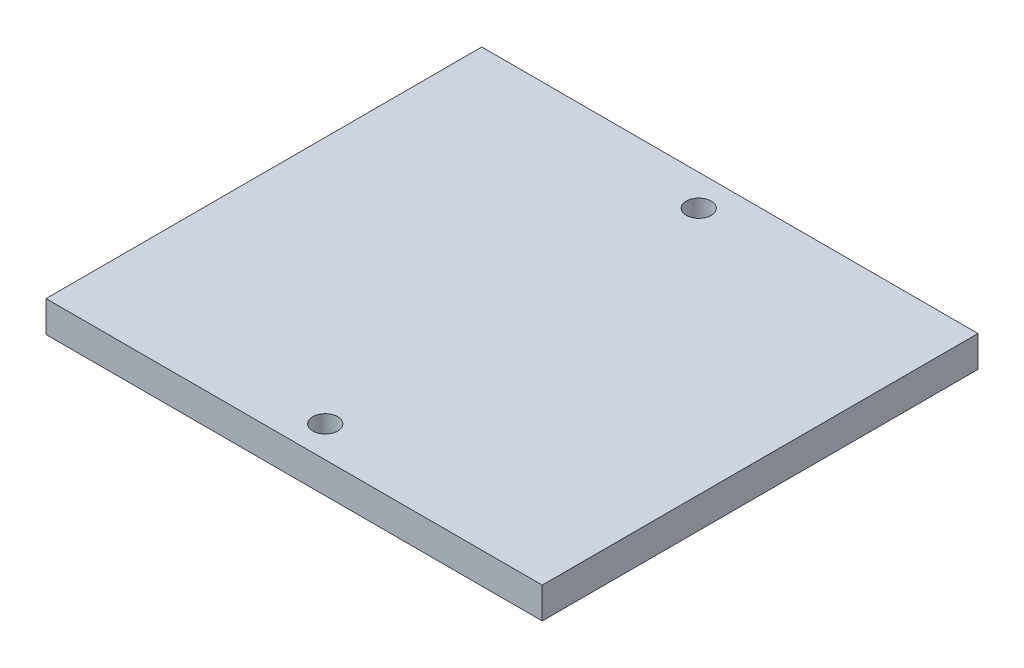
ISO-10303-21;
HEADER;
FILE_DESCRIPTION(('STEP AP214'),'2;1');
FILE_NAME('part.step','',(''),(''),'','','');
FILE_SCHEMA(('AUTOMOTIVE_DESIGN { 1 0 10303 214 1 1 1 1 }'));
ENDSEC;
DATA;
#1=APPLICATION_CONTEXT('core data for automotive mechanical design processes');
#2=APPLICATION_PROTOCOL_DEFINITION('international standard','automotive_design',2000,#1);
#3=PRODUCT_CONTEXT('',#1,'mechanical');
#4=PRODUCT('Part','Part','',(#3));
#5=PRODUCT_RELATED_PRODUCT_CATEGORY('part','',(#4));
#6=PRODUCT_DEFINITION_FORMATION('','',#4);
#7=PRODUCT_DEFINITION_CONTEXT('part definition',#1,'design');
#8=PRODUCT_DEFINITION('design','',#6,#7);
#9=PRODUCT_DEFINITION_SHAPE('','',#8);
#10=(LENGTH_UNIT() NAMED_UNIT(*) SI_UNIT(.MILLI.,.METRE.));
#11=(NAMED_UNIT(*) PLANE_ANGLE_UNIT() SI_UNIT($,.RADIAN.));
#12=(NAMED_UNIT(*) SI_UNIT($,.STERADIAN.) SOLID_ANGLE_UNIT());
#13=UNCERTAINTY_MEASURE_WITH_UNIT(LENGTH_MEASURE(1.E-05),#10,'distance_accuracy_value','');
#14=(GEOMETRIC_REPRESENTATION_CONTEXT(3) GLOBAL_UNCERTAINTY_ASSIGNED_CONTEXT((#13)) GLOBAL_UNIT_ASSIGNED_CONTEXT((#10,
#11,#12)) REPRESENTATION_CONTEXT('',''));
#15=CARTESIAN_POINT('',(0.,0.,0.));
#16=DIRECTION('',(0.,0.,1.));
#17=DIRECTION('',(1.,0.,0.));
#18=AXIS2_PLACEMENT_3D('',#15,#16,#17);
#19=CARTESIAN_POINT('',(50.61875,6.35,44.45));
#20=DIRECTION('',(-1.,0.,0.));
#21=DIRECTION('',(0.,0.,1.));
#22=AXIS2_PLACEMENT_3D('',#19,#20,#21);
#23=PLANE('',#22);
#24=DIRECTION('',(0.,0.,-1.));
#25=VECTOR('',#24,1.);
#26=CARTESIAN_POINT('',(50.61875,0.,44.45));
#27=LINE('',#26,#25);
#28=CARTESIAN_POINT('',(50.61875,0.,44.45));
#29=VERTEX_POINT('',#28);
#30=CARTESIAN_POINT('',(50.61875,0.,-44.45));
#31=VERTEX_POINT('',#30);
#32=EDGE_CURVE('E111',#29,#31,#27,.T.);
#33=ORIENTED_EDGE('',*,*,#32,.T.);
#34=DIRECTION('',(0.,-1.,0.));
#35=VECTOR('',#34,1.);
#36=CARTESIAN_POINT('',(50.61875,6.35,-44.45));
#37=LINE('',#36,#35);
#38=CARTESIAN_POINT('',(50.61875,6.35,-44.45));
#39=VERTEX_POINT('',#38);
#40=EDGE_CURVE('E11',#39,#31,#37,.T.);
#41=ORIENTED_EDGE('',*,*,#40,.F.);
#42=DIRECTION('',(0.,0.,-1.));
#43=VECTOR('',#42,1.);
#44=CARTESIAN_POINT('',(50.61875,6.35,44.45));
#45=LINE('',#44,#43);
#46=CARTESIAN_POINT('',(50.61875,6.35,44.45));
#47=VERTEX_POINT('',#46);
#48=EDGE_CURVE('E95',#47,#39,#45,.T.);
#49=ORIENTED_EDGE('',*,*,#48,.F.);
#50=DIRECTION('',(0.,-1.,0.));
#51=VECTOR('',#50,1.);
#52=CARTESIAN_POINT('',(50.61875,6.35,44.45));
#53=LINE('',#52,#51);
#54=EDGE_CURVE('E107',#47,#29,#53,.T.);
#55=ORIENTED_EDGE('',*,*,#54,.T.);
#56=EDGE_LOOP('',(#33,#41,#49,#55));
#57=FACE_BOUND('',#56,.T.);
#58=ADVANCED_FACE('F43',(#57),#23,.F.);
#59=CARTESIAN_POINT('',(-50.61875,6.35,-44.45));
#60=DIRECTION('',(0.,0.,1.));
#61=DIRECTION('',(1.,0.,0.));
#62=AXIS2_PLACEMENT_3D('',#59,#60,#61);
#63=PLANE('',#62);
#64=DIRECTION('',(-1.,0.,0.));
#65=VECTOR('',#64,1.);
#66=CARTESIAN_POINT('',(-50.61875,0.,-44.45));
#67=LINE('',#66,#65);
#68=CARTESIAN_POINT('',(-50.61875,0.,-44.45));
#69=VERTEX_POINT('',#68);
#70=EDGE_CURVE('E100',#31,#69,#67,.T.);
#71=ORIENTED_EDGE('',*,*,#70,.T.);
#72=DIRECTION('',(0.,-1.,0.));
#73=VECTOR('',#72,1.);
#74=CARTESIAN_POINT('',(-50.61875,6.35,-44.45));
#75=LINE('',#74,#73);
#76=CARTESIAN_POINT('',(-50.61875,6.35,-44.45));
#77=VERTEX_POINT('',#76);
#78=EDGE_CURVE('E52',#77,#69,#75,.T.);
#79=ORIENTED_EDGE('',*,*,#78,.F.);
#80=DIRECTION('',(-1.,0.,0.));
#81=VECTOR('',#80,1.);
#82=CARTESIAN_POINT('',(-50.61875,6.35,-44.45));
#83=LINE('',#82,#81);
#84=EDGE_CURVE('E90',#39,#77,#83,.T.);
#85=ORIENTED_EDGE('',*,*,#84,.F.);
#86=ORIENTED_EDGE('',*,*,#40,.T.);
#87=EDGE_LOOP('',(#71,#79,#85,#86));
#88=FACE_BOUND('',#87,.T.);
#89=ADVANCED_FACE('F99',(#88),#63,.F.);
#90=CARTESIAN_POINT('',(-50.61875,6.35,44.45));
#91=DIRECTION('',(1.,0.,0.));
#92=DIRECTION('',(0.,0.,-1.));
#93=AXIS2_PLACEMENT_3D('',#90,#91,#92);
#94=PLANE('',#93);
#95=DIRECTION('',(0.,0.,1.));
#96=VECTOR('',#95,1.);
#97=CARTESIAN_POINT('',(-50.61875,0.,44.45));
#98=LINE('',#97,#96);
#99=CARTESIAN_POINT('',(-50.61875,0.,44.45));
#100=VERTEX_POINT('',#99);
#101=EDGE_CURVE('E77',#69,#100,#98,.T.);
#102=ORIENTED_EDGE('',*,*,#101,.T.);
#103=DIRECTION('',(0.,-1.,0.));
#104=VECTOR('',#103,1.);
#105=CARTESIAN_POINT('',(-50.61875,6.35,44.45));
#106=LINE('',#105,#104);
#107=CARTESIAN_POINT('',(-50.61875,6.35,44.45));
#108=VERTEX_POINT('',#107);
#109=EDGE_CURVE('E102',#108,#100,#106,.T.);
#110=ORIENTED_EDGE('',*,*,#109,.F.);
#111=DIRECTION('',(0.,0.,1.));
#112=VECTOR('',#111,1.);
#113=CARTESIAN_POINT('',(-50.61875,6.35,44.45));
#114=LINE('',#113,#112);
#115=EDGE_CURVE('E93',#77,#108,#114,.T.);
#116=ORIENTED_EDGE('',*,*,#115,.F.);
#117=ORIENTED_EDGE('',*,*,#78,.T.);
#118=EDGE_LOOP('',(#102,#110,#116,#117));
#119=FACE_BOUND('',#118,.T.);
#120=ADVANCED_FACE('F103',(#119),#94,.F.);
#121=CARTESIAN_POINT('',(-50.61875,6.35,44.45));
#122=DIRECTION('',(0.,0.,-1.));
#123=DIRECTION('',(-1.,0.,0.));
#124=AXIS2_PLACEMENT_3D('',#121,#122,#123);
#125=PLANE('',#124);
#126=DIRECTION('',(1.,0.,0.));
#127=VECTOR('',#126,1.);
#128=CARTESIAN_POINT('',(-50.61875,0.,44.45));
#129=LINE('',#128,#127);
#130=EDGE_CURVE('E83',#100,#29,#129,.T.);
#131=ORIENTED_EDGE('',*,*,#130,.T.);
#132=ORIENTED_EDGE('',*,*,#54,.F.);
#133=DIRECTION('',(1.,0.,0.));
#134=VECTOR('',#133,1.);
#135=CARTESIAN_POINT('',(-50.61875,6.35,44.45));
#136=LINE('',#135,#134);
#137=EDGE_CURVE('E60',#108,#47,#136,.T.);
#138=ORIENTED_EDGE('',*,*,#137,.F.);
#139=ORIENTED_EDGE('',*,*,#109,.T.);
#140=EDGE_LOOP('',(#131,#132,#138,#139));
#141=FACE_BOUND('',#140,.T.);
#142=ADVANCED_FACE('F125',(#141),#125,.F.);
#143=CARTESIAN_POINT('',(0.,6.35,0.));
#144=DIRECTION('',(0.,-1.,0.));
#145=DIRECTION('',(0.,0.,-1.));
#146=AXIS2_PLACEMENT_3D('',#143,#144,#145);
#147=PLANE('',#146);
#148=CARTESIAN_POINT('',(0.,6.35,-38.1));
#149=DIRECTION('',(0.,1.,0.));
#150=DIRECTION('',(0.,0.,1.));
#151=AXIS2_PLACEMENT_3D('',#148,#149,#150);
#152=CIRCLE('',#151,2.54);
#153=CARTESIAN_POINT('',(0.,6.35,-35.56));
#154=VERTEX_POINT('',#153);
#155=EDGE_CURVE('E140',#154,#154,#152,.T.);
#156=ORIENTED_EDGE('',*,*,#155,.F.);
#157=EDGE_LOOP('',(#156));
#158=FACE_BOUND('',#157,.T.);
#159=CARTESIAN_POINT('',(0.,6.35,38.1));
#160=DIRECTION('',(0.,1.,0.));
#161=DIRECTION('',(0.,0.,-1.));
#162=AXIS2_PLACEMENT_3D('',#159,#160,#161);
#163=CIRCLE('',#162,2.54);
#164=CARTESIAN_POINT('',(0.,6.35,35.56));
#165=VERTEX_POINT('',#164);
#166=EDGE_CURVE('E136',#165,#165,#163,.T.);
#167=ORIENTED_EDGE('',*,*,#166,.F.);
#168=EDGE_LOOP('',(#167));
#169=FACE_BOUND('',#168,.T.);
#170=ORIENTED_EDGE('',*,*,#48,.T.);
#171=ORIENTED_EDGE('',*,*,#84,.T.);
#172=ORIENTED_EDGE('',*,*,#115,.T.);
#173=ORIENTED_EDGE('',*,*,#137,.T.);
#174=EDGE_LOOP('',(#170,#171,#172,#173));
#175=FACE_BOUND('',#174,.T.);
#176=ADVANCED_FACE('F91',(#158,#169,#175),#147,.F.);
#177=CARTESIAN_POINT('',(0.,0.,0.));
#178=DIRECTION('',(0.,-1.,0.));
#179=DIRECTION('',(0.,0.,-1.));
#180=AXIS2_PLACEMENT_3D('',#177,#178,#179);
#181=PLANE('',#180);
#182=CARTESIAN_POINT('',(0.,0.,-38.1));
#183=DIRECTION('',(0.,1.,0.));
#184=DIRECTION('',(0.,0.,1.));
#185=AXIS2_PLACEMENT_3D('',#182,#183,#184);
#186=CIRCLE('',#185,2.54);
#187=CARTESIAN_POINT('',(0.,0.,-35.56));
#188=VERTEX_POINT('',#187);
#189=EDGE_CURVE('E115',#188,#188,#186,.T.);
#190=ORIENTED_EDGE('',*,*,#189,.T.);
#191=EDGE_LOOP('',(#190));
#192=FACE_BOUND('',#191,.T.);
#193=CARTESIAN_POINT('',(0.,0.,38.1));
#194=DIRECTION('',(0.,1.,0.));
#195=DIRECTION('',(0.,0.,-1.));
#196=AXIS2_PLACEMENT_3D('',#193,#194,#195);
#197=CIRCLE('',#196,2.54);
#198=CARTESIAN_POINT('',(0.,0.,35.56));
#199=VERTEX_POINT('',#198);
#200=EDGE_CURVE('E132',#199,#199,#197,.T.);
#201=ORIENTED_EDGE('',*,*,#200,.T.);
#202=EDGE_LOOP('',(#201));
#203=FACE_BOUND('',#202,.T.);
#204=ORIENTED_EDGE('',*,*,#32,.F.);
#205=ORIENTED_EDGE('',*,*,#130,.F.);
#206=ORIENTED_EDGE('',*,*,#101,.F.);
#207=ORIENTED_EDGE('',*,*,#70,.F.);
#208=EDGE_LOOP('',(#204,#205,#206,#207));
#209=FACE_BOUND('',#208,.T.);
#210=ADVANCED_FACE('F128',(#192,#203,#209),#181,.T.);
#211=CARTESIAN_POINT('',(0.,0.,38.1));
#212=DIRECTION('',(0.,1.,0.));
#213=DIRECTION('',(0.,0.,1.));
#214=AXIS2_PLACEMENT_3D('',#211,#212,#213);
#215=CYLINDRICAL_SURFACE('',#214,2.54);
#216=ORIENTED_EDGE('',*,*,#200,.F.);
#217=EDGE_LOOP('',(#216));
#218=FACE_BOUND('',#217,.T.);
#219=ORIENTED_EDGE('',*,*,#166,.T.);
#220=EDGE_LOOP('',(#219));
#221=FACE_BOUND('',#220,.T.);
#222=ADVANCED_FACE('F153',(#218,#221),#215,.F.);
#223=CARTESIAN_POINT('',(0.,0.,-38.1));
#224=DIRECTION('',(0.,1.,0.));
#225=DIRECTION('',(0.,0.,1.));
#226=AXIS2_PLACEMENT_3D('',#223,#224,#225);
#227=CYLINDRICAL_SURFACE('',#226,2.54);
#228=ORIENTED_EDGE('',*,*,#189,.F.);
#229=EDGE_LOOP('',(#228));
#230=FACE_BOUND('',#229,.T.);
#231=ORIENTED_EDGE('',*,*,#155,.T.);
#232=EDGE_LOOP('',(#231));
#233=FACE_BOUND('',#232,.T.);
#234=ADVANCED_FACE('F150',(#230,#233),#227,.F.);
#235=CLOSED_SHELL('',(#58,#89,#120,#142,#176,#210,#222,#234));
#236=MANIFOLD_SOLID_BREP('B2',#235);
#237=ADVANCED_BREP_SHAPE_REPRESENTATION('',(#18,#236),#14);
#238=SHAPE_DEFINITION_REPRESENTATION(#9,#237);
ENDSEC;
END-ISO-10303-21;
